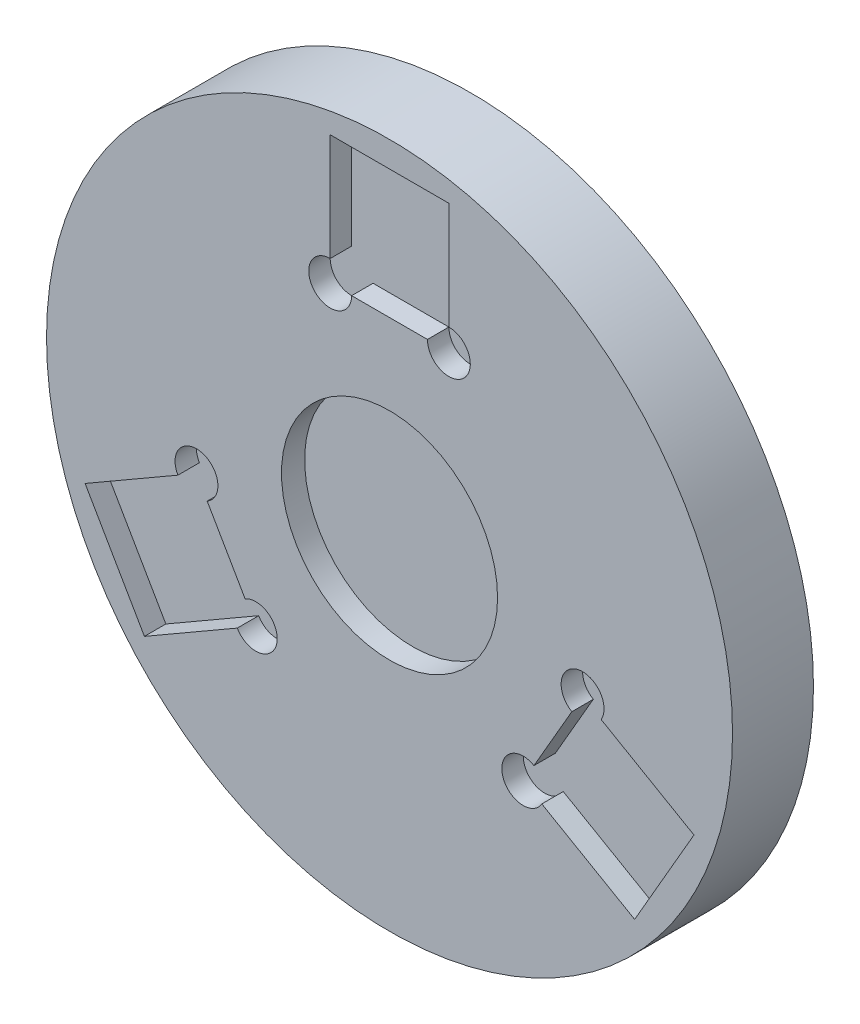
ISO-10303-21;
HEADER;
FILE_DESCRIPTION(('STEP AP214'),'2;1');
FILE_NAME('part.step','',(''),(''),'','','');
FILE_SCHEMA(('AUTOMOTIVE_DESIGN { 1 0 10303 214 1 1 1 1 }'));
ENDSEC;
DATA;
#1=APPLICATION_CONTEXT('core data for automotive mechanical design processes');
#2=APPLICATION_PROTOCOL_DEFINITION('international standard','automotive_design',2000,#1);
#3=PRODUCT_CONTEXT('',#1,'mechanical');
#4=PRODUCT('Part','Part','',(#3));
#5=PRODUCT_RELATED_PRODUCT_CATEGORY('part','',(#4));
#6=PRODUCT_DEFINITION_FORMATION('','',#4);
#7=PRODUCT_DEFINITION_CONTEXT('part definition',#1,'design');
#8=PRODUCT_DEFINITION('design','',#6,#7);
#9=PRODUCT_DEFINITION_SHAPE('','',#8);
#10=(LENGTH_UNIT() NAMED_UNIT(*) SI_UNIT(.MILLI.,.METRE.));
#11=(NAMED_UNIT(*) PLANE_ANGLE_UNIT() SI_UNIT($,.RADIAN.));
#12=(NAMED_UNIT(*) SI_UNIT($,.STERADIAN.) SOLID_ANGLE_UNIT());
#13=UNCERTAINTY_MEASURE_WITH_UNIT(LENGTH_MEASURE(1.E-05),#10,'distance_accuracy_value','');
#14=(GEOMETRIC_REPRESENTATION_CONTEXT(3) GLOBAL_UNCERTAINTY_ASSIGNED_CONTEXT((#13)) GLOBAL_UNIT_ASSIGNED_CONTEXT((#10,
#11,#12)) REPRESENTATION_CONTEXT('',''));
#15=CARTESIAN_POINT('',(0.,0.,0.));
#16=DIRECTION('',(0.,0.,1.));
#17=DIRECTION('',(1.,0.,0.));
#18=AXIS2_PLACEMENT_3D('',#15,#16,#17);
#19=CARTESIAN_POINT('',(0.,0.,11.9888));
#20=DIRECTION('',(0.,0.,-1.));
#21=DIRECTION('',(-1.,0.,0.));
#22=AXIS2_PLACEMENT_3D('',#19,#20,#21);
#23=CYLINDRICAL_SURFACE('',#22,50.8);
#24=CARTESIAN_POINT('',(0.,0.,11.9888));
#25=DIRECTION('',(0.,0.,1.));
#26=DIRECTION('',(1.,0.,0.));
#27=AXIS2_PLACEMENT_3D('',#24,#25,#26);
#28=CIRCLE('',#27,50.8);
#29=CARTESIAN_POINT('',(-50.8,0.,11.9888));
#30=VERTEX_POINT('',#29);
#31=EDGE_CURVE('E11',#30,#30,#28,.T.);
#32=CARTESIAN_POINT('',(0.,0.,0.));
#33=DIRECTION('',(0.,0.,1.));
#34=DIRECTION('',(1.,0.,0.));
#35=AXIS2_PLACEMENT_3D('',#32,#33,#34);
#36=CIRCLE('',#35,50.8);
#37=CARTESIAN_POINT('',(-50.8,0.,0.));
#38=VERTEX_POINT('',#37);
#39=EDGE_CURVE('E35',#38,#38,#36,.T.);
#40=CARTESIAN_POINT('',(-50.8,0.,11.9888));
#41=CARTESIAN_POINT('',(-50.8,0.,11.8639166666667));
#42=CARTESIAN_POINT('',(-50.8,0.,11.7390333333333));
#43=CARTESIAN_POINT('',(-50.8,0.,11.4892666666667));
#44=CARTESIAN_POINT('',(-50.8,0.,11.3643833333333));
#45=CARTESIAN_POINT('',(-50.8,0.,11.1146166666667));
#46=CARTESIAN_POINT('',(-50.8,0.,10.9897333333333));
#47=CARTESIAN_POINT('',(-50.8,0.,10.7399666666667));
#48=CARTESIAN_POINT('',(-50.8,0.,10.6150833333333));
#49=CARTESIAN_POINT('',(-50.8,0.,10.3653166666667));
#50=CARTESIAN_POINT('',(-50.8,0.,10.2404333333333));
#51=CARTESIAN_POINT('',(-50.8,0.,9.99066666666667));
#52=CARTESIAN_POINT('',(-50.8,0.,9.86578333333333));
#53=CARTESIAN_POINT('',(-50.8,0.,9.61601666666667));
#54=CARTESIAN_POINT('',(-50.8,0.,9.49113333333333));
#55=CARTESIAN_POINT('',(-50.8,0.,9.24136666666667));
#56=CARTESIAN_POINT('',(-50.8,0.,9.11648333333333));
#57=CARTESIAN_POINT('',(-50.8,0.,8.86671666666667));
#58=CARTESIAN_POINT('',(-50.8,0.,8.74183333333333));
#59=CARTESIAN_POINT('',(-50.8,0.,8.49206666666666));
#60=CARTESIAN_POINT('',(-50.8,0.,8.36718333333333));
#61=CARTESIAN_POINT('',(-50.8,0.,8.11741666666667));
#62=CARTESIAN_POINT('',(-50.8,0.,7.99253333333333));
#63=CARTESIAN_POINT('',(-50.8,0.,7.74276666666667));
#64=CARTESIAN_POINT('',(-50.8,0.,7.61788333333333));
#65=CARTESIAN_POINT('',(-50.8,0.,7.36811666666667));
#66=CARTESIAN_POINT('',(-50.8,0.,7.24323333333333));
#67=CARTESIAN_POINT('',(-50.8,0.,6.99346666666667));
#68=CARTESIAN_POINT('',(-50.8,0.,6.86858333333333));
#69=CARTESIAN_POINT('',(-50.8,0.,6.61881666666666));
#70=CARTESIAN_POINT('',(-50.8,0.,6.49393333333333));
#71=CARTESIAN_POINT('',(-50.8,0.,6.24416666666666));
#72=CARTESIAN_POINT('',(-50.8,0.,6.11928333333333));
#73=CARTESIAN_POINT('',(-50.8,0.,5.86951666666667));
#74=CARTESIAN_POINT('',(-50.8,0.,5.74463333333333));
#75=CARTESIAN_POINT('',(-50.8,0.,5.49486666666667));
#76=CARTESIAN_POINT('',(-50.8,0.,5.36998333333333));
#77=CARTESIAN_POINT('',(-50.8,0.,5.12021666666667));
#78=CARTESIAN_POINT('',(-50.8,0.,4.99533333333333));
#79=CARTESIAN_POINT('',(-50.8,0.,4.74556666666667));
#80=CARTESIAN_POINT('',(-50.8,0.,4.62068333333333));
#81=CARTESIAN_POINT('',(-50.8,0.,4.37091666666667));
#82=CARTESIAN_POINT('',(-50.8,0.,4.24603333333333));
#83=CARTESIAN_POINT('',(-50.8,0.,3.99626666666667));
#84=CARTESIAN_POINT('',(-50.8,0.,3.87138333333333));
#85=CARTESIAN_POINT('',(-50.8,0.,3.62161666666667));
#86=CARTESIAN_POINT('',(-50.8,0.,3.49673333333333));
#87=CARTESIAN_POINT('',(-50.8,0.,3.24696666666667));
#88=CARTESIAN_POINT('',(-50.8,0.,3.12208333333333));
#89=CARTESIAN_POINT('',(-50.8,0.,2.87231666666667));
#90=CARTESIAN_POINT('',(-50.8,0.,2.74743333333333));
#91=CARTESIAN_POINT('',(-50.8,0.,2.49766666666667));
#92=CARTESIAN_POINT('',(-50.8,0.,2.37278333333333));
#93=CARTESIAN_POINT('',(-50.8,0.,2.12301666666667));
#94=CARTESIAN_POINT('',(-50.8,0.,1.99813333333333));
#95=CARTESIAN_POINT('',(-50.8,0.,1.74836666666667));
#96=CARTESIAN_POINT('',(-50.8,0.,1.62348333333333));
#97=CARTESIAN_POINT('',(-50.8,0.,1.37371666666667));
#98=CARTESIAN_POINT('',(-50.8,0.,1.24883333333333));
#99=CARTESIAN_POINT('',(-50.8,0.,0.999066666666667));
#100=CARTESIAN_POINT('',(-50.8,0.,0.874183333333333));
#101=CARTESIAN_POINT('',(-50.8,0.,0.624416666666667));
#102=CARTESIAN_POINT('',(-50.8,0.,0.499533333333334));
#103=CARTESIAN_POINT('',(-50.8,0.,0.249766666666667));
#104=CARTESIAN_POINT('',(-50.8,0.,0.124883333333333));
#105=CARTESIAN_POINT('',(-50.8,0.,0.));
#106=B_SPLINE_CURVE_WITH_KNOTS('',3,(#40,#41,#42,#43,#44,#45,#46,#47,#48,#49,#50,#51,#52,#53,
#54,#55,#56,#57,#58,#59,#60,#61,#62,#63,#64,#65,#66,#67,#68,#69,#70,#71,#72,#73,#74,#75,#76,#77,
#78,#79,#80,#81,#82,#83,#84,#85,#86,#87,#88,#89,#90,#91,#92,#93,#94,#95,#96,#97,#98,#99,#100,
#101,#102,#103,#104,#105),.UNSPECIFIED.,.F.,.F.,(4,2,2,2,2,2,2,2,2,2,2,2,2,2,2,2,2,2,2,2,2,2,2,
2,2,2,2,2,2,2,2,2,4),(0.,0.374650000000001,0.749300000000001,1.12395,1.4986,1.87325,2.2479,
2.62255,2.9972,3.37185,3.7465,4.12115,4.4958,4.87045,5.2451,5.61975,5.9944,6.36905,6.7437,
7.11835,7.493,7.86765,8.2423,8.61695,8.9916,9.36625,9.7409,10.11555,10.4902,10.86485,11.2395,
11.61415,11.9888),.UNSPECIFIED.);
#107=EDGE_CURVE('BSEAM32',#30,#38,#106,.T.);
#108=ORIENTED_EDGE('',*,*,#31,.F.);
#109=ORIENTED_EDGE('',*,*,#39,.T.);
#110=ORIENTED_EDGE('',*,*,#107,.T.);
#111=ORIENTED_EDGE('',*,*,#107,.F.);
#112=EDGE_LOOP('',(#108,#110,#109,#111));
#113=FACE_BOUND('',#112,.T.);
#114=ADVANCED_FACE('F32',(#113),#23,.T.);
#115=CARTESIAN_POINT('',(0.,0.,11.9888));
#116=DIRECTION('',(0.,0.,1.));
#117=DIRECTION('',(1.,0.,0.));
#118=AXIS2_PLACEMENT_3D('',#115,#116,#117);
#119=PLANE('',#118);
#120=CARTESIAN_POINT('',(0.,0.,11.9888));
#121=DIRECTION('',(0.,0.,1.));
#122=DIRECTION('',(1.,0.,0.));
#123=AXIS2_PLACEMENT_3D('',#120,#121,#122);
#124=CIRCLE('',#123,16.002);
#125=CARTESIAN_POINT('',(16.002,0.,11.9888));
#126=VERTEX_POINT('',#125);
#127=EDGE_CURVE('E535',#126,#126,#124,.T.);
#128=ORIENTED_EDGE('',*,*,#127,.F.);
#129=EDGE_LOOP('',(#128));
#130=FACE_BOUND('',#129,.T.);
#131=CARTESIAN_POINT('',(19.8031847817374,-21.5798778063562,11.9888));
#132=DIRECTION('',(0.,0.,1.));
#133=DIRECTION('',(-0.499999999999992,-0.866025403784443,0.));
#134=AXIS2_PLACEMENT_3D('',#131,#132,#133);
#135=CIRCLE('',#134,3.175);
#136=CARTESIAN_POINT('',(21.3906847817374,-18.8302471493406,11.9888));
#137=VERTEX_POINT('',#136);
#138=CARTESIAN_POINT('',(22.552815438753,-23.1673778063561,11.9888));
#139=VERTEX_POINT('',#138);
#140=EDGE_CURVE('E164',#137,#139,#135,.T.);
#141=ORIENTED_EDGE('',*,*,#140,.F.);
#142=DIRECTION('',(-0.499999999999992,-0.866025403784443,0.));
#143=VECTOR('',#142,1.);
#144=CARTESIAN_POINT('',(28.5903147817373,-6.36012219364338,11.9888));
#145=LINE('',#144,#143);
#146=CARTESIAN_POINT('',(27.0028147817373,-9.10975285065899,11.9888));
#147=VERTEX_POINT('',#146);
#148=EDGE_CURVE('E182',#147,#137,#145,.T.);
#149=ORIENTED_EDGE('',*,*,#148,.F.);
#150=CARTESIAN_POINT('',(28.5903147817373,-6.36012219364338,11.9888));
#151=DIRECTION('',(0.,0.,1.));
#152=DIRECTION('',(-0.499999999999992,-0.866025403784443,0.));
#153=AXIS2_PLACEMENT_3D('',#150,#151,#152);
#154=CIRCLE('',#153,3.175);
#155=CARTESIAN_POINT('',(31.3399454387529,-7.94762219364336,11.9888));
#156=VERTEX_POINT('',#155);
#157=EDGE_CURVE('E166',#156,#147,#154,.T.);
#158=ORIENTED_EDGE('',*,*,#157,.F.);
#159=DIRECTION('',(-0.866025403784443,0.499999999999992,0.));
#160=VECTOR('',#159,1.);
#161=CARTESIAN_POINT('',(45.0880987238309,-15.8851221936432,11.9888));
#162=LINE('',#161,#160);
#163=CARTESIAN_POINT('',(45.0880987238309,-15.8851221936432,11.9888));
#164=VERTEX_POINT('',#163);
#165=EDGE_CURVE('E187',#164,#156,#162,.T.);
#166=ORIENTED_EDGE('',*,*,#165,.F.);
#167=DIRECTION('',(0.499999999999992,0.866025403784443,0.));
#168=VECTOR('',#167,1.);
#169=CARTESIAN_POINT('',(45.0880987238309,-15.8851221936432,11.9888));
#170=LINE('',#169,#168);
#171=CARTESIAN_POINT('',(36.3009687238311,-31.104877806356,11.9888));
#172=VERTEX_POINT('',#171);
#173=EDGE_CURVE('E197',#172,#164,#170,.T.);
#174=ORIENTED_EDGE('',*,*,#173,.F.);
#175=DIRECTION('',(0.866025403784443,-0.499999999999992,0.));
#176=VECTOR('',#175,1.);
#177=CARTESIAN_POINT('',(36.3009687238311,-31.104877806356,11.9888));
#178=LINE('',#177,#176);
#179=EDGE_CURVE('E46',#139,#172,#178,.T.);
#180=ORIENTED_EDGE('',*,*,#179,.F.);
#181=EDGE_LOOP('',(#141,#149,#158,#166,#174,#180));
#182=FACE_BOUND('',#181,.T.);
#183=CARTESIAN_POINT('',(-28.5903147817372,-6.36012219364378,11.9888));
#184=DIRECTION('',(0.,0.,1.));
#185=DIRECTION('',(-0.500000000000004,0.866025403784436,0.));
#186=AXIS2_PLACEMENT_3D('',#183,#184,#185);
#187=CIRCLE('',#186,3.175);
#188=CARTESIAN_POINT('',(-27.0028147817372,-9.10975285065936,11.9888));
#189=VERTEX_POINT('',#188);
#190=CARTESIAN_POINT('',(-31.3399454387528,-7.94762219364379,11.9888));
#191=VERTEX_POINT('',#190);
#192=EDGE_CURVE('E551',#189,#191,#187,.T.);
#193=ORIENTED_EDGE('',*,*,#192,.F.);
#194=DIRECTION('',(-0.500000000000004,0.866025403784436,0.));
#195=VECTOR('',#194,1.);
#196=CARTESIAN_POINT('',(-19.8031847817371,-21.5798778063564,11.9888));
#197=LINE('',#196,#195);
#198=CARTESIAN_POINT('',(-21.3906847817371,-18.8302471493409,11.9888));
#199=VERTEX_POINT('',#198);
#200=EDGE_CURVE('E208',#199,#189,#197,.T.);
#201=ORIENTED_EDGE('',*,*,#200,.F.);
#202=CARTESIAN_POINT('',(-19.8031847817371,-21.5798778063564,11.9888));
#203=DIRECTION('',(0.,0.,1.));
#204=DIRECTION('',(-0.500000000000004,0.866025403784436,0.));
#205=AXIS2_PLACEMENT_3D('',#202,#203,#204);
#206=CIRCLE('',#205,3.175);
#207=CARTESIAN_POINT('',(-22.5528154387527,-23.1673778063565,11.9888));
#208=VERTEX_POINT('',#207);
#209=EDGE_CURVE('E560',#208,#199,#206,.T.);
#210=ORIENTED_EDGE('',*,*,#209,.F.);
#211=DIRECTION('',(0.866025403784436,0.500000000000004,0.));
#212=VECTOR('',#211,1.);
#213=CARTESIAN_POINT('',(-36.3009687238306,-31.1048778063565,11.9888));
#214=LINE('',#213,#212);
#215=CARTESIAN_POINT('',(-36.3009687238306,-31.1048778063565,11.9888));
#216=VERTEX_POINT('',#215);
#217=EDGE_CURVE('E222',#216,#208,#214,.T.);
#218=ORIENTED_EDGE('',*,*,#217,.F.);
#219=DIRECTION('',(0.500000000000004,-0.866025403784436,0.));
#220=VECTOR('',#219,1.);
#221=CARTESIAN_POINT('',(-36.3009687238306,-31.1048778063565,11.9888));
#222=LINE('',#221,#220);
#223=CARTESIAN_POINT('',(-45.0880987238307,-15.8851221936439,11.9888));
#224=VERTEX_POINT('',#223);
#225=EDGE_CURVE('E219',#224,#216,#222,.T.);
#226=ORIENTED_EDGE('',*,*,#225,.F.);
#227=DIRECTION('',(-0.866025403784436,-0.500000000000004,0.));
#228=VECTOR('',#227,1.);
#229=CARTESIAN_POINT('',(-45.0880987238307,-15.8851221936439,11.9888));
#230=LINE('',#229,#228);
#231=EDGE_CURVE('E54',#191,#224,#230,.T.);
#232=ORIENTED_EDGE('',*,*,#231,.F.);
#233=EDGE_LOOP('',(#193,#201,#210,#218,#226,#232));
#234=FACE_BOUND('',#233,.T.);
#235=CARTESIAN_POINT('',(8.78713,27.94,11.9888));
#236=DIRECTION('',(0.,0.,1.));
#237=DIRECTION('',(1.,0.,0.));
#238=AXIS2_PLACEMENT_3D('',#235,#236,#237);
#239=CIRCLE('',#238,3.175);
#240=CARTESIAN_POINT('',(5.61213,27.94,11.9888));
#241=VERTEX_POINT('',#240);
#242=CARTESIAN_POINT('',(8.78713,31.115,11.9888));
#243=VERTEX_POINT('',#242);
#244=EDGE_CURVE('E229',#241,#243,#239,.T.);
#245=ORIENTED_EDGE('',*,*,#244,.F.);
#246=DIRECTION('',(1.,0.,0.));
#247=VECTOR('',#246,1.);
#248=CARTESIAN_POINT('',(-8.78712999999999,27.94,11.9888));
#249=LINE('',#248,#247);
#250=CARTESIAN_POINT('',(-5.61212999999999,27.94,11.9888));
#251=VERTEX_POINT('',#250);
#252=EDGE_CURVE('E254',#251,#241,#249,.T.);
#253=ORIENTED_EDGE('',*,*,#252,.F.);
#254=CARTESIAN_POINT('',(-8.78712999999999,27.94,11.9888));
#255=DIRECTION('',(0.,0.,1.));
#256=DIRECTION('',(1.,0.,0.));
#257=AXIS2_PLACEMENT_3D('',#254,#255,#256);
#258=CIRCLE('',#257,3.175);
#259=CARTESIAN_POINT('',(-8.78713,31.115,11.9888));
#260=VERTEX_POINT('',#259);
#261=EDGE_CURVE('E240',#260,#251,#258,.T.);
#262=ORIENTED_EDGE('',*,*,#261,.F.);
#263=DIRECTION('',(0.,-1.,0.));
#264=VECTOR('',#263,1.);
#265=CARTESIAN_POINT('',(-8.78713,46.99,11.9888));
#266=LINE('',#265,#264);
#267=CARTESIAN_POINT('',(-8.78713,46.99,11.9888));
#268=VERTEX_POINT('',#267);
#269=EDGE_CURVE('E268',#268,#260,#266,.T.);
#270=ORIENTED_EDGE('',*,*,#269,.F.);
#271=DIRECTION('',(-1.,0.,0.));
#272=VECTOR('',#271,1.);
#273=CARTESIAN_POINT('',(-8.78713,46.99,11.9888));
#274=LINE('',#273,#272);
#275=CARTESIAN_POINT('',(8.78713,46.99,11.9888));
#276=VERTEX_POINT('',#275);
#277=EDGE_CURVE('E265',#276,#268,#274,.T.);
#278=ORIENTED_EDGE('',*,*,#277,.F.);
#279=DIRECTION('',(0.,1.,0.));
#280=VECTOR('',#279,1.);
#281=CARTESIAN_POINT('',(8.78713,46.99,11.9888));
#282=LINE('',#281,#280);
#283=EDGE_CURVE('E250',#243,#276,#282,.T.);
#284=ORIENTED_EDGE('',*,*,#283,.F.);
#285=EDGE_LOOP('',(#245,#253,#262,#270,#278,#284));
#286=FACE_BOUND('',#285,.T.);
#287=ORIENTED_EDGE('',*,*,#31,.T.);
#288=EDGE_LOOP('',(#287));
#289=FACE_BOUND('',#288,.T.);
#290=ADVANCED_FACE('F287',(#130,#182,#234,#286,#289),#119,.T.);
#291=CARTESIAN_POINT('',(0.,0.,0.));
#292=DIRECTION('',(0.,0.,1.));
#293=DIRECTION('',(1.,0.,0.));
#294=AXIS2_PLACEMENT_3D('',#291,#292,#293);
#295=PLANE('',#294);
#296=ORIENTED_EDGE('',*,*,#39,.F.);
#297=EDGE_LOOP('',(#296));
#298=FACE_BOUND('',#297,.T.);
#299=ADVANCED_FACE('F320',(#298),#295,.F.);
#300=CARTESIAN_POINT('',(8.78713,46.99,8.8138));
#301=DIRECTION('',(1.,0.,0.));
#302=DIRECTION('',(0.,1.,0.));
#303=AXIS2_PLACEMENT_3D('',#300,#301,#302);
#304=PLANE('',#303);
#305=DIRECTION('',(0.,1.,0.));
#306=VECTOR('',#305,1.);
#307=CARTESIAN_POINT('',(8.78713,46.99,8.8138));
#308=LINE('',#307,#306);
#309=CARTESIAN_POINT('',(8.78713,31.115,8.8138));
#310=VERTEX_POINT('',#309);
#311=CARTESIAN_POINT('',(8.78713,46.99,8.8138));
#312=VERTEX_POINT('',#311);
#313=EDGE_CURVE('E251',#310,#312,#308,.T.);
#314=ORIENTED_EDGE('',*,*,#313,.F.);
#315=DIRECTION('',(0.,0.,1.));
#316=VECTOR('',#315,1.);
#317=CARTESIAN_POINT('',(8.78713,31.115,-0.166456121069155));
#318=LINE('',#317,#316);
#319=EDGE_CURVE('E237',#310,#243,#318,.T.);
#320=ORIENTED_EDGE('',*,*,#319,.T.);
#321=ORIENTED_EDGE('',*,*,#283,.T.);
#322=DIRECTION('',(0.,0.,1.));
#323=VECTOR('',#322,1.);
#324=CARTESIAN_POINT('',(8.78713,46.99,8.8138));
#325=LINE('',#324,#323);
#326=EDGE_CURVE('E263',#312,#276,#325,.T.);
#327=ORIENTED_EDGE('',*,*,#326,.F.);
#328=EDGE_LOOP('',(#314,#320,#321,#327));
#329=FACE_BOUND('',#328,.T.);
#330=ADVANCED_FACE('F298',(#329),#304,.F.);
#331=CARTESIAN_POINT('',(-8.78712999999999,27.94,8.8138));
#332=DIRECTION('',(0.,-1.,0.));
#333=DIRECTION('',(0.,0.,-1.));
#334=AXIS2_PLACEMENT_3D('',#331,#332,#333);
#335=PLANE('',#334);
#336=ORIENTED_EDGE('',*,*,#252,.T.);
#337=DIRECTION('',(0.,0.,1.));
#338=VECTOR('',#337,1.);
#339=CARTESIAN_POINT('',(5.61213,27.94,-0.166456121069155));
#340=LINE('',#339,#338);
#341=CARTESIAN_POINT('',(5.61213,27.94,8.8138));
#342=VERTEX_POINT('',#341);
#343=EDGE_CURVE('E234',#241,#342,#340,.F.);
#344=ORIENTED_EDGE('',*,*,#343,.T.);
#345=DIRECTION('',(1.,0.,0.));
#346=VECTOR('',#345,1.);
#347=CARTESIAN_POINT('',(-8.78712999999999,27.94,8.8138));
#348=LINE('',#347,#346);
#349=CARTESIAN_POINT('',(-5.61212999999999,27.94,8.8138));
#350=VERTEX_POINT('',#349);
#351=EDGE_CURVE('E260',#350,#342,#348,.T.);
#352=ORIENTED_EDGE('',*,*,#351,.F.);
#353=DIRECTION('',(0.,0.,1.));
#354=VECTOR('',#353,1.);
#355=CARTESIAN_POINT('',(-5.61212999999999,27.94,-0.166456121069155));
#356=LINE('',#355,#354);
#357=EDGE_CURVE('E247',#350,#251,#356,.T.);
#358=ORIENTED_EDGE('',*,*,#357,.T.);
#359=EDGE_LOOP('',(#336,#344,#352,#358));
#360=FACE_BOUND('',#359,.T.);
#361=ADVANCED_FACE('F302',(#360),#335,.F.);
#362=CARTESIAN_POINT('',(-8.78713,46.99,8.8138));
#363=DIRECTION('',(-1.,0.,0.));
#364=DIRECTION('',(0.,-1.,0.));
#365=AXIS2_PLACEMENT_3D('',#362,#363,#364);
#366=PLANE('',#365);
#367=ORIENTED_EDGE('',*,*,#269,.T.);
#368=DIRECTION('',(0.,0.,1.));
#369=VECTOR('',#368,1.);
#370=CARTESIAN_POINT('',(-8.78713,31.115,-0.166456121069155));
#371=LINE('',#370,#369);
#372=CARTESIAN_POINT('',(-8.78713,31.115,8.8138));
#373=VERTEX_POINT('',#372);
#374=EDGE_CURVE('E244',#260,#373,#371,.F.);
#375=ORIENTED_EDGE('',*,*,#374,.T.);
#376=DIRECTION('',(0.,-1.,0.));
#377=VECTOR('',#376,1.);
#378=CARTESIAN_POINT('',(-8.78713,46.99,8.8138));
#379=LINE('',#378,#377);
#380=CARTESIAN_POINT('',(-8.78713,46.99,8.8138));
#381=VERTEX_POINT('',#380);
#382=EDGE_CURVE('E257',#381,#373,#379,.T.);
#383=ORIENTED_EDGE('',*,*,#382,.F.);
#384=DIRECTION('',(0.,0.,1.));
#385=VECTOR('',#384,1.);
#386=CARTESIAN_POINT('',(-8.78713,46.99,8.8138));
#387=LINE('',#386,#385);
#388=EDGE_CURVE('E273',#381,#268,#387,.T.);
#389=ORIENTED_EDGE('',*,*,#388,.T.);
#390=EDGE_LOOP('',(#367,#375,#383,#389));
#391=FACE_BOUND('',#390,.T.);
#392=ADVANCED_FACE('F292',(#391),#366,.F.);
#393=CARTESIAN_POINT('',(-8.78713,46.99,8.8138));
#394=DIRECTION('',(0.,1.,0.));
#395=DIRECTION('',(0.,0.,1.));
#396=AXIS2_PLACEMENT_3D('',#393,#394,#395);
#397=PLANE('',#396);
#398=ORIENTED_EDGE('',*,*,#277,.T.);
#399=ORIENTED_EDGE('',*,*,#388,.F.);
#400=DIRECTION('',(-1.,0.,0.));
#401=VECTOR('',#400,1.);
#402=CARTESIAN_POINT('',(-8.78713,46.99,8.8138));
#403=LINE('',#402,#401);
#404=EDGE_CURVE('E253',#312,#381,#403,.T.);
#405=ORIENTED_EDGE('',*,*,#404,.F.);
#406=ORIENTED_EDGE('',*,*,#326,.T.);
#407=EDGE_LOOP('',(#398,#399,#405,#406));
#408=FACE_BOUND('',#407,.T.);
#409=ADVANCED_FACE('F280',(#408),#397,.F.);
#410=CARTESIAN_POINT('',(0.,0.,8.8138));
#411=DIRECTION('',(0.,0.,1.));
#412=DIRECTION('',(1.,0.,0.));
#413=AXIS2_PLACEMENT_3D('',#410,#411,#412);
#414=PLANE('',#413);
#415=CARTESIAN_POINT('',(8.78713,27.94,8.8138));
#416=DIRECTION('',(0.,0.,1.));
#417=DIRECTION('',(1.,0.,0.));
#418=AXIS2_PLACEMENT_3D('',#415,#416,#417);
#419=CIRCLE('',#418,3.175);
#420=EDGE_CURVE('E232',#310,#342,#419,.F.);
#421=ORIENTED_EDGE('',*,*,#420,.F.);
#422=ORIENTED_EDGE('',*,*,#313,.T.);
#423=ORIENTED_EDGE('',*,*,#404,.T.);
#424=ORIENTED_EDGE('',*,*,#382,.T.);
#425=CARTESIAN_POINT('',(-8.78712999999999,27.94,8.8138));
#426=DIRECTION('',(0.,0.,1.));
#427=DIRECTION('',(1.,0.,0.));
#428=AXIS2_PLACEMENT_3D('',#425,#426,#427);
#429=CIRCLE('',#428,3.175);
#430=EDGE_CURVE('E242',#350,#373,#429,.F.);
#431=ORIENTED_EDGE('',*,*,#430,.F.);
#432=ORIENTED_EDGE('',*,*,#351,.T.);
#433=EDGE_LOOP('',(#421,#422,#423,#424,#431,#432));
#434=FACE_BOUND('',#433,.T.);
#435=ADVANCED_FACE('F297',(#434),#414,.T.);
#436=CARTESIAN_POINT('',(-8.78712999999999,27.94,-0.166456121069155));
#437=DIRECTION('',(0.,0.,1.));
#438=DIRECTION('',(1.,0.,0.));
#439=AXIS2_PLACEMENT_3D('',#436,#437,#438);
#440=CYLINDRICAL_SURFACE('',#439,3.175);
#441=ORIENTED_EDGE('',*,*,#430,.T.);
#442=ORIENTED_EDGE('',*,*,#374,.F.);
#443=ORIENTED_EDGE('',*,*,#261,.T.);
#444=ORIENTED_EDGE('',*,*,#357,.F.);
#445=EDGE_LOOP('',(#441,#442,#443,#444));
#446=FACE_BOUND('',#445,.T.);
#447=ADVANCED_FACE('F305',(#446),#440,.F.);
#448=CARTESIAN_POINT('',(8.78713,27.94,-0.166456121069155));
#449=DIRECTION('',(0.,0.,1.));
#450=DIRECTION('',(1.,0.,0.));
#451=AXIS2_PLACEMENT_3D('',#448,#449,#450);
#452=CYLINDRICAL_SURFACE('',#451,3.175);
#453=ORIENTED_EDGE('',*,*,#420,.T.);
#454=ORIENTED_EDGE('',*,*,#343,.F.);
#455=ORIENTED_EDGE('',*,*,#244,.T.);
#456=ORIENTED_EDGE('',*,*,#319,.F.);
#457=EDGE_LOOP('',(#453,#454,#455,#456));
#458=FACE_BOUND('',#457,.T.);
#459=ADVANCED_FACE('F300',(#458),#452,.F.);
#460=CARTESIAN_POINT('',(-45.0880987238307,-15.8851221936439,8.8138));
#461=DIRECTION('',(-0.500000000000004,0.866025403784436,0.));
#462=DIRECTION('',(-0.866025403784436,-0.500000000000004,0.));
#463=AXIS2_PLACEMENT_3D('',#460,#461,#462);
#464=PLANE('',#463);
#465=DIRECTION('',(-0.866025403784436,-0.500000000000004,0.));
#466=VECTOR('',#465,1.);
#467=CARTESIAN_POINT('',(-45.0880987238307,-15.8851221936439,8.8138));
#468=LINE('',#467,#466);
#469=CARTESIAN_POINT('',(-31.3399454387528,-7.94762219364379,8.8138));
#470=VERTEX_POINT('',#469);
#471=CARTESIAN_POINT('',(-45.0880987238307,-15.8851221936439,8.8138));
#472=VERTEX_POINT('',#471);
#473=EDGE_CURVE('E205',#470,#472,#468,.T.);
#474=ORIENTED_EDGE('',*,*,#473,.F.);
#475=DIRECTION('',(0.,0.,1.));
#476=VECTOR('',#475,1.);
#477=CARTESIAN_POINT('',(-31.3399454387528,-7.94762219364379,-0.16645612106916));
#478=LINE('',#477,#476);
#479=EDGE_CURVE('E558',#470,#191,#478,.T.);
#480=ORIENTED_EDGE('',*,*,#479,.T.);
#481=ORIENTED_EDGE('',*,*,#231,.T.);
#482=DIRECTION('',(0.,0.,1.));
#483=VECTOR('',#482,1.);
#484=CARTESIAN_POINT('',(-45.0880987238307,-15.8851221936439,8.8138));
#485=LINE('',#484,#483);
#486=EDGE_CURVE('E217',#472,#224,#485,.T.);
#487=ORIENTED_EDGE('',*,*,#486,.F.);
#488=EDGE_LOOP('',(#474,#480,#481,#487));
#489=FACE_BOUND('',#488,.T.);
#490=ADVANCED_FACE('F312',(#489),#464,.F.);
#491=CARTESIAN_POINT('',(-19.8031847817371,-21.5798778063564,8.8138));
#492=DIRECTION('',(0.866025403784436,0.500000000000004,0.));
#493=DIRECTION('',(-0.500000000000004,0.866025403784436,0.));
#494=AXIS2_PLACEMENT_3D('',#491,#492,#493);
#495=PLANE('',#494);
#496=ORIENTED_EDGE('',*,*,#200,.T.);
#497=DIRECTION('',(0.,0.,1.));
#498=VECTOR('',#497,1.);
#499=CARTESIAN_POINT('',(-27.0028147817372,-9.10975285065936,-0.16645612106916));
#500=LINE('',#499,#498);
#501=CARTESIAN_POINT('',(-27.0028147817372,-9.10975285065936,8.8138));
#502=VERTEX_POINT('',#501);
#503=EDGE_CURVE('E555',#189,#502,#500,.F.);
#504=ORIENTED_EDGE('',*,*,#503,.T.);
#505=DIRECTION('',(-0.500000000000004,0.866025403784436,0.));
#506=VECTOR('',#505,1.);
#507=CARTESIAN_POINT('',(-19.8031847817371,-21.5798778063564,8.8138));
#508=LINE('',#507,#506);
#509=CARTESIAN_POINT('',(-21.3906847817371,-18.8302471493409,8.8138));
#510=VERTEX_POINT('',#509);
#511=EDGE_CURVE('E214',#510,#502,#508,.T.);
#512=ORIENTED_EDGE('',*,*,#511,.F.);
#513=DIRECTION('',(0.,0.,1.));
#514=VECTOR('',#513,1.);
#515=CARTESIAN_POINT('',(-21.3906847817371,-18.8302471493409,-0.16645612106916));
#516=LINE('',#515,#514);
#517=EDGE_CURVE('E190',#510,#199,#516,.T.);
#518=ORIENTED_EDGE('',*,*,#517,.T.);
#519=EDGE_LOOP('',(#496,#504,#512,#518));
#520=FACE_BOUND('',#519,.T.);
#521=ADVANCED_FACE('F375',(#520),#495,.F.);
#522=CARTESIAN_POINT('',(-36.3009687238306,-31.1048778063565,8.8138));
#523=DIRECTION('',(0.500000000000004,-0.866025403784436,0.));
#524=DIRECTION('',(0.866025403784436,0.500000000000004,0.));
#525=AXIS2_PLACEMENT_3D('',#522,#523,#524);
#526=PLANE('',#525);
#527=ORIENTED_EDGE('',*,*,#217,.T.);
#528=DIRECTION('',(0.,0.,1.));
#529=VECTOR('',#528,1.);
#530=CARTESIAN_POINT('',(-22.5528154387527,-23.1673778063565,-0.16645612106916));
#531=LINE('',#530,#529);
#532=CARTESIAN_POINT('',(-22.5528154387527,-23.1673778063565,8.8138));
#533=VERTEX_POINT('',#532);
#534=EDGE_CURVE('E563',#208,#533,#531,.F.);
#535=ORIENTED_EDGE('',*,*,#534,.T.);
#536=DIRECTION('',(0.866025403784436,0.500000000000004,0.));
#537=VECTOR('',#536,1.);
#538=CARTESIAN_POINT('',(-36.3009687238306,-31.1048778063565,8.8138));
#539=LINE('',#538,#537);
#540=CARTESIAN_POINT('',(-36.3009687238306,-31.1048778063565,8.8138));
#541=VERTEX_POINT('',#540);
#542=EDGE_CURVE('E211',#541,#533,#539,.T.);
#543=ORIENTED_EDGE('',*,*,#542,.F.);
#544=DIRECTION('',(0.,0.,1.));
#545=VECTOR('',#544,1.);
#546=CARTESIAN_POINT('',(-36.3009687238306,-31.1048778063565,8.8138));
#547=LINE('',#546,#545);
#548=EDGE_CURVE('E227',#541,#216,#547,.T.);
#549=ORIENTED_EDGE('',*,*,#548,.T.);
#550=EDGE_LOOP('',(#527,#535,#543,#549));
#551=FACE_BOUND('',#550,.T.);
#552=ADVANCED_FACE('F384',(#551),#526,.F.);
#553=CARTESIAN_POINT('',(-36.3009687238306,-31.1048778063565,8.8138));
#554=DIRECTION('',(-0.866025403784436,-0.500000000000004,0.));
#555=DIRECTION('',(0.500000000000004,-0.866025403784436,0.));
#556=AXIS2_PLACEMENT_3D('',#553,#554,#555);
#557=PLANE('',#556);
#558=ORIENTED_EDGE('',*,*,#225,.T.);
#559=ORIENTED_EDGE('',*,*,#548,.F.);
#560=DIRECTION('',(0.500000000000004,-0.866025403784436,0.));
#561=VECTOR('',#560,1.);
#562=CARTESIAN_POINT('',(-36.3009687238306,-31.1048778063565,8.8138));
#563=LINE('',#562,#561);
#564=EDGE_CURVE('E207',#472,#541,#563,.T.);
#565=ORIENTED_EDGE('',*,*,#564,.F.);
#566=ORIENTED_EDGE('',*,*,#486,.T.);
#567=EDGE_LOOP('',(#558,#559,#565,#566));
#568=FACE_BOUND('',#567,.T.);
#569=ADVANCED_FACE('F394',(#568),#557,.F.);
#570=CARTESIAN_POINT('',(0.,0.,8.8138));
#571=DIRECTION('',(0.,0.,1.));
#572=DIRECTION('',(-0.500000000000004,0.866025403784436,0.));
#573=AXIS2_PLACEMENT_3D('',#570,#571,#572);
#574=PLANE('',#573);
#575=CARTESIAN_POINT('',(-28.5903147817372,-6.36012219364378,8.8138));
#576=DIRECTION('',(0.,0.,1.));
#577=DIRECTION('',(1.,0.,0.));
#578=AXIS2_PLACEMENT_3D('',#575,#576,#577);
#579=CIRCLE('',#578,3.175);
#580=EDGE_CURVE('E553',#470,#502,#579,.F.);
#581=ORIENTED_EDGE('',*,*,#580,.F.);
#582=ORIENTED_EDGE('',*,*,#473,.T.);
#583=ORIENTED_EDGE('',*,*,#564,.T.);
#584=ORIENTED_EDGE('',*,*,#542,.T.);
#585=CARTESIAN_POINT('',(-19.8031847817371,-21.5798778063564,8.8138));
#586=DIRECTION('',(0.,0.,1.));
#587=DIRECTION('',(1.,0.,0.));
#588=AXIS2_PLACEMENT_3D('',#585,#586,#587);
#589=CIRCLE('',#588,3.175);
#590=EDGE_CURVE('E562',#510,#533,#589,.F.);
#591=ORIENTED_EDGE('',*,*,#590,.F.);
#592=ORIENTED_EDGE('',*,*,#511,.T.);
#593=EDGE_LOOP('',(#581,#582,#583,#584,#591,#592));
#594=FACE_BOUND('',#593,.T.);
#595=ADVANCED_FACE('F404',(#594),#574,.T.);
#596=CARTESIAN_POINT('',(36.3009687238311,-31.104877806356,8.8138));
#597=DIRECTION('',(-0.499999999999992,-0.866025403784443,0.));
#598=DIRECTION('',(0.866025403784443,-0.499999999999992,0.));
#599=AXIS2_PLACEMENT_3D('',#596,#597,#598);
#600=PLANE('',#599);
#601=DIRECTION('',(0.866025403784443,-0.499999999999992,0.));
#602=VECTOR('',#601,1.);
#603=CARTESIAN_POINT('',(36.3009687238311,-31.104877806356,8.8138));
#604=LINE('',#603,#602);
#605=CARTESIAN_POINT('',(22.552815438753,-23.1673778063561,8.8138));
#606=VERTEX_POINT('',#605);
#607=CARTESIAN_POINT('',(36.3009687238311,-31.104877806356,8.8138));
#608=VERTEX_POINT('',#607);
#609=EDGE_CURVE('E173',#606,#608,#604,.T.);
#610=ORIENTED_EDGE('',*,*,#609,.F.);
#611=DIRECTION('',(0.,0.,1.));
#612=VECTOR('',#611,1.);
#613=CARTESIAN_POINT('',(22.552815438753,-23.1673778063561,-0.166456121069155));
#614=LINE('',#613,#612);
#615=EDGE_CURVE('E158',#606,#139,#614,.T.);
#616=ORIENTED_EDGE('',*,*,#615,.T.);
#617=ORIENTED_EDGE('',*,*,#179,.T.);
#618=DIRECTION('',(0.,0.,1.));
#619=VECTOR('',#618,1.);
#620=CARTESIAN_POINT('',(36.3009687238311,-31.104877806356,8.8138));
#621=LINE('',#620,#619);
#622=EDGE_CURVE('E179',#608,#172,#621,.T.);
#623=ORIENTED_EDGE('',*,*,#622,.F.);
#624=EDGE_LOOP('',(#610,#616,#617,#623));
#625=FACE_BOUND('',#624,.T.);
#626=ADVANCED_FACE('F178',(#625),#600,.F.);
#627=CARTESIAN_POINT('',(28.5903147817373,-6.36012219364338,8.8138));
#628=DIRECTION('',(-0.866025403784443,0.499999999999992,0.));
#629=DIRECTION('',(-0.499999999999992,-0.866025403784443,0.));
#630=AXIS2_PLACEMENT_3D('',#627,#628,#629);
#631=PLANE('',#630);
#632=ORIENTED_EDGE('',*,*,#148,.T.);
#633=DIRECTION('',(0.,0.,1.));
#634=VECTOR('',#633,1.);
#635=CARTESIAN_POINT('',(21.3906847817374,-18.8302471493406,-0.166456121069155));
#636=LINE('',#635,#634);
#637=CARTESIAN_POINT('',(21.3906847817374,-18.8302471493406,8.8138));
#638=VERTEX_POINT('',#637);
#639=EDGE_CURVE('E167',#137,#638,#636,.F.);
#640=ORIENTED_EDGE('',*,*,#639,.T.);
#641=DIRECTION('',(-0.499999999999992,-0.866025403784443,0.));
#642=VECTOR('',#641,1.);
#643=CARTESIAN_POINT('',(28.5903147817373,-6.36012219364338,8.8138));
#644=LINE('',#643,#642);
#645=CARTESIAN_POINT('',(27.0028147817373,-9.10975285065899,8.8138));
#646=VERTEX_POINT('',#645);
#647=EDGE_CURVE('E176',#646,#638,#644,.T.);
#648=ORIENTED_EDGE('',*,*,#647,.F.);
#649=DIRECTION('',(0.,0.,1.));
#650=VECTOR('',#649,1.);
#651=CARTESIAN_POINT('',(27.0028147817373,-9.10975285065899,-0.166456121069155));
#652=LINE('',#651,#650);
#653=EDGE_CURVE('E548',#646,#147,#652,.T.);
#654=ORIENTED_EDGE('',*,*,#653,.T.);
#655=EDGE_LOOP('',(#632,#640,#648,#654));
#656=FACE_BOUND('',#655,.T.);
#657=ADVANCED_FACE('F426',(#656),#631,.F.);
#658=CARTESIAN_POINT('',(45.0880987238309,-15.8851221936432,8.8138));
#659=DIRECTION('',(0.499999999999992,0.866025403784443,0.));
#660=DIRECTION('',(-0.866025403784443,0.499999999999992,0.));
#661=AXIS2_PLACEMENT_3D('',#658,#659,#660);
#662=PLANE('',#661);
#663=ORIENTED_EDGE('',*,*,#165,.T.);
#664=DIRECTION('',(0.,0.,1.));
#665=VECTOR('',#664,1.);
#666=CARTESIAN_POINT('',(31.3399454387529,-7.94762219364336,-0.166456121069155));
#667=LINE('',#666,#665);
#668=CARTESIAN_POINT('',(31.3399454387529,-7.94762219364336,8.8138));
#669=VERTEX_POINT('',#668);
#670=EDGE_CURVE('E545',#156,#669,#667,.F.);
#671=ORIENTED_EDGE('',*,*,#670,.T.);
#672=DIRECTION('',(-0.866025403784443,0.499999999999992,0.));
#673=VECTOR('',#672,1.);
#674=CARTESIAN_POINT('',(45.0880987238309,-15.8851221936432,8.8138));
#675=LINE('',#674,#673);
#676=CARTESIAN_POINT('',(45.0880987238309,-15.8851221936432,8.8138));
#677=VERTEX_POINT('',#676);
#678=EDGE_CURVE('E184',#677,#669,#675,.T.);
#679=ORIENTED_EDGE('',*,*,#678,.F.);
#680=DIRECTION('',(0.,0.,1.));
#681=VECTOR('',#680,1.);
#682=CARTESIAN_POINT('',(45.0880987238309,-15.8851221936432,8.8138));
#683=LINE('',#682,#681);
#684=EDGE_CURVE('E202',#677,#164,#683,.T.);
#685=ORIENTED_EDGE('',*,*,#684,.T.);
#686=EDGE_LOOP('',(#663,#671,#679,#685));
#687=FACE_BOUND('',#686,.T.);
#688=ADVANCED_FACE('F435',(#687),#662,.F.);
#689=CARTESIAN_POINT('',(45.0880987238309,-15.8851221936432,8.8138));
#690=DIRECTION('',(0.866025403784443,-0.499999999999992,0.));
#691=DIRECTION('',(0.499999999999992,0.866025403784443,0.));
#692=AXIS2_PLACEMENT_3D('',#689,#690,#691);
#693=PLANE('',#692);
#694=ORIENTED_EDGE('',*,*,#173,.T.);
#695=ORIENTED_EDGE('',*,*,#684,.F.);
#696=DIRECTION('',(0.499999999999992,0.866025403784443,0.));
#697=VECTOR('',#696,1.);
#698=CARTESIAN_POINT('',(45.0880987238309,-15.8851221936432,8.8138));
#699=LINE('',#698,#697);
#700=EDGE_CURVE('E181',#608,#677,#699,.T.);
#701=ORIENTED_EDGE('',*,*,#700,.F.);
#702=ORIENTED_EDGE('',*,*,#622,.T.);
#703=EDGE_LOOP('',(#694,#695,#701,#702));
#704=FACE_BOUND('',#703,.T.);
#705=ADVANCED_FACE('F445',(#704),#693,.F.);
#706=CARTESIAN_POINT('',(0.,0.,8.8138));
#707=DIRECTION('',(0.,0.,1.));
#708=DIRECTION('',(-0.499999999999992,-0.866025403784443,0.));
#709=AXIS2_PLACEMENT_3D('',#706,#707,#708);
#710=PLANE('',#709);
#711=CARTESIAN_POINT('',(19.8031847817374,-21.5798778063562,8.8138));
#712=DIRECTION('',(0.,0.,1.));
#713=DIRECTION('',(1.,0.,0.));
#714=AXIS2_PLACEMENT_3D('',#711,#712,#713);
#715=CIRCLE('',#714,3.175);
#716=EDGE_CURVE('E161',#606,#638,#715,.F.);
#717=ORIENTED_EDGE('',*,*,#716,.F.);
#718=ORIENTED_EDGE('',*,*,#609,.T.);
#719=ORIENTED_EDGE('',*,*,#700,.T.);
#720=ORIENTED_EDGE('',*,*,#678,.T.);
#721=CARTESIAN_POINT('',(28.5903147817373,-6.36012219364338,8.8138));
#722=DIRECTION('',(0.,0.,1.));
#723=DIRECTION('',(1.,0.,0.));
#724=AXIS2_PLACEMENT_3D('',#721,#722,#723);
#725=CIRCLE('',#724,3.175);
#726=EDGE_CURVE('E543',#646,#669,#725,.F.);
#727=ORIENTED_EDGE('',*,*,#726,.F.);
#728=ORIENTED_EDGE('',*,*,#647,.T.);
#729=EDGE_LOOP('',(#717,#718,#719,#720,#727,#728));
#730=FACE_BOUND('',#729,.T.);
#731=ADVANCED_FACE('F171',(#730),#710,.T.);
#732=CARTESIAN_POINT('',(-19.8031847817371,-21.5798778063564,-0.16645612106916));
#733=DIRECTION('',(0.,0.,1.));
#734=DIRECTION('',(1.,0.,0.));
#735=AXIS2_PLACEMENT_3D('',#732,#733,#734);
#736=CYLINDRICAL_SURFACE('',#735,3.175);
#737=ORIENTED_EDGE('',*,*,#590,.T.);
#738=ORIENTED_EDGE('',*,*,#534,.F.);
#739=ORIENTED_EDGE('',*,*,#209,.T.);
#740=ORIENTED_EDGE('',*,*,#517,.F.);
#741=EDGE_LOOP('',(#737,#738,#739,#740));
#742=FACE_BOUND('',#741,.T.);
#743=ADVANCED_FACE('F463',(#742),#736,.F.);
#744=CARTESIAN_POINT('',(-28.5903147817372,-6.36012219364378,-0.16645612106916));
#745=DIRECTION('',(0.,0.,1.));
#746=DIRECTION('',(1.,0.,0.));
#747=AXIS2_PLACEMENT_3D('',#744,#745,#746);
#748=CYLINDRICAL_SURFACE('',#747,3.175);
#749=ORIENTED_EDGE('',*,*,#580,.T.);
#750=ORIENTED_EDGE('',*,*,#503,.F.);
#751=ORIENTED_EDGE('',*,*,#192,.T.);
#752=ORIENTED_EDGE('',*,*,#479,.F.);
#753=EDGE_LOOP('',(#749,#750,#751,#752));
#754=FACE_BOUND('',#753,.T.);
#755=ADVANCED_FACE('F472',(#754),#748,.F.);
#756=CARTESIAN_POINT('',(28.5903147817373,-6.36012219364338,-0.166456121069155));
#757=DIRECTION('',(0.,0.,1.));
#758=DIRECTION('',(1.,0.,0.));
#759=AXIS2_PLACEMENT_3D('',#756,#757,#758);
#760=CYLINDRICAL_SURFACE('',#759,3.175);
#761=ORIENTED_EDGE('',*,*,#726,.T.);
#762=ORIENTED_EDGE('',*,*,#670,.F.);
#763=ORIENTED_EDGE('',*,*,#157,.T.);
#764=ORIENTED_EDGE('',*,*,#653,.F.);
#765=EDGE_LOOP('',(#761,#762,#763,#764));
#766=FACE_BOUND('',#765,.T.);
#767=ADVANCED_FACE('F482',(#766),#760,.F.);
#768=CARTESIAN_POINT('',(19.8031847817374,-21.5798778063562,-0.166456121069155));
#769=DIRECTION('',(0.,0.,1.));
#770=DIRECTION('',(1.,0.,0.));
#771=AXIS2_PLACEMENT_3D('',#768,#769,#770);
#772=CYLINDRICAL_SURFACE('',#771,3.175);
#773=ORIENTED_EDGE('',*,*,#716,.T.);
#774=ORIENTED_EDGE('',*,*,#639,.F.);
#775=ORIENTED_EDGE('',*,*,#140,.T.);
#776=ORIENTED_EDGE('',*,*,#615,.F.);
#777=EDGE_LOOP('',(#773,#774,#775,#776));
#778=FACE_BOUND('',#777,.T.);
#779=ADVANCED_FACE('F160',(#778),#772,.F.);
#780=CARTESIAN_POINT('',(0.,0.,8.5598));
#781=DIRECTION('',(0.,0.,1.));
#782=DIRECTION('',(1.,0.,0.));
#783=AXIS2_PLACEMENT_3D('',#780,#781,#782);
#784=CYLINDRICAL_SURFACE('',#783,16.002);
#785=CARTESIAN_POINT('',(0.,0.,8.5598));
#786=DIRECTION('',(0.,0.,1.));
#787=DIRECTION('',(1.,0.,0.));
#788=AXIS2_PLACEMENT_3D('',#785,#786,#787);
#789=CIRCLE('',#788,16.002);
#790=CARTESIAN_POINT('',(16.002,0.,8.5598));
#791=VERTEX_POINT('',#790);
#792=EDGE_CURVE('E534',#791,#791,#789,.T.);
#793=ORIENTED_EDGE('',*,*,#792,.F.);
#794=EDGE_LOOP('',(#793));
#795=FACE_BOUND('',#794,.T.);
#796=ORIENTED_EDGE('',*,*,#127,.T.);
#797=EDGE_LOOP('',(#796));
#798=FACE_BOUND('',#797,.T.);
#799=ADVANCED_FACE('F501',(#795,#798),#784,.F.);
#800=CARTESIAN_POINT('',(0.,0.,8.5598));
#801=DIRECTION('',(0.,0.,1.));
#802=DIRECTION('',(1.,0.,0.));
#803=AXIS2_PLACEMENT_3D('',#800,#801,#802);
#804=PLANE('',#803);
#805=ORIENTED_EDGE('',*,*,#792,.T.);
#806=EDGE_LOOP('',(#805));
#807=FACE_BOUND('',#806,.T.);
#808=ADVANCED_FACE('F518',(#807),#804,.T.);
#809=CLOSED_SHELL('',(#114,#290,#299,#330,#361,#392,#409,#435,#447,#459,#490,#521,#552,#569,
#595,#626,#657,#688,#705,#731,#743,#755,#767,#779,#799,#808));
#810=MANIFOLD_SOLID_BREP('B2',#809);
#811=ADVANCED_BREP_SHAPE_REPRESENTATION('',(#18,#810),#14);
#812=SHAPE_DEFINITION_REPRESENTATION(#9,#811);
ENDSEC;
END-ISO-10303-21;
